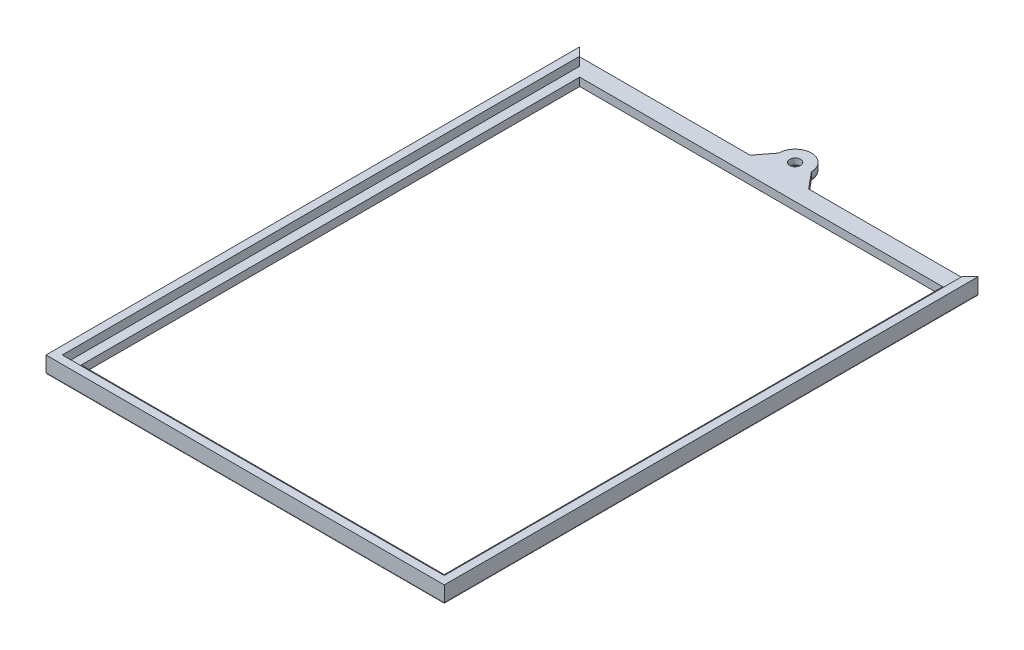
ISO-10303-21;
HEADER;
FILE_DESCRIPTION(('STEP AP214'),'2;1');
FILE_NAME('part.step','',(''),(''),'','','');
FILE_SCHEMA(('AUTOMOTIVE_DESIGN { 1 0 10303 214 1 1 1 1 }'));
ENDSEC;
DATA;
#1=APPLICATION_CONTEXT('core data for automotive mechanical design processes');
#2=APPLICATION_PROTOCOL_DEFINITION('international standard','automotive_design',2000,#1);
#3=PRODUCT_CONTEXT('',#1,'mechanical');
#4=PRODUCT('Part','Part','',(#3));
#5=PRODUCT_RELATED_PRODUCT_CATEGORY('part','',(#4));
#6=PRODUCT_DEFINITION_FORMATION('','',#4);
#7=PRODUCT_DEFINITION_CONTEXT('part definition',#1,'design');
#8=PRODUCT_DEFINITION('design','',#6,#7);
#9=PRODUCT_DEFINITION_SHAPE('','',#8);
#10=(LENGTH_UNIT() NAMED_UNIT(*) SI_UNIT(.MILLI.,.METRE.));
#11=(NAMED_UNIT(*) PLANE_ANGLE_UNIT() SI_UNIT($,.RADIAN.));
#12=(NAMED_UNIT(*) SI_UNIT($,.STERADIAN.) SOLID_ANGLE_UNIT());
#13=UNCERTAINTY_MEASURE_WITH_UNIT(LENGTH_MEASURE(1.E-05),#10,'distance_accuracy_value','');
#14=(GEOMETRIC_REPRESENTATION_CONTEXT(3) GLOBAL_UNCERTAINTY_ASSIGNED_CONTEXT((#13)) GLOBAL_UNIT_ASSIGNED_CONTEXT((#10,
#11,#12)) REPRESENTATION_CONTEXT('',''));
#15=CARTESIAN_POINT('',(0.,0.,0.));
#16=DIRECTION('',(0.,0.,1.));
#17=DIRECTION('',(1.,0.,0.));
#18=AXIS2_PLACEMENT_3D('',#15,#16,#17);
#19=CARTESIAN_POINT('',(0.,1.5,-52.25));
#20=DIRECTION('',(0.,1.,0.));
#21=DIRECTION('',(0.,0.,1.));
#22=AXIS2_PLACEMENT_3D('',#19,#20,#21);
#23=PLANE('',#22);
#24=DIRECTION('',(-1.,0.,0.));
#25=VECTOR('',#24,1.);
#26=CARTESIAN_POINT('',(33.5,1.5,-46.));
#27=LINE('',#26,#25);
#28=CARTESIAN_POINT('',(33.5,1.5,-46.));
#29=VERTEX_POINT('',#28);
#30=CARTESIAN_POINT('',(-33.5,1.5,-46.));
#31=VERTEX_POINT('',#30);
#32=EDGE_CURVE('E246',#29,#31,#27,.T.);
#33=ORIENTED_EDGE('',*,*,#32,.F.);
#34=DIRECTION('',(0.,0.,-1.));
#35=VECTOR('',#34,1.);
#36=CARTESIAN_POINT('',(33.5,1.5,46.));
#37=LINE('',#36,#35);
#38=CARTESIAN_POINT('',(33.5,1.5,46.));
#39=VERTEX_POINT('',#38);
#40=EDGE_CURVE('E244',#39,#29,#37,.T.);
#41=ORIENTED_EDGE('',*,*,#40,.F.);
#42=DIRECTION('',(1.,0.,0.));
#43=VECTOR('',#42,1.);
#44=CARTESIAN_POINT('',(33.5,1.5,46.));
#45=LINE('',#44,#43);
#46=CARTESIAN_POINT('',(-33.5,1.5,46.));
#47=VERTEX_POINT('',#46);
#48=EDGE_CURVE('E252',#47,#39,#45,.T.);
#49=ORIENTED_EDGE('',*,*,#48,.F.);
#50=DIRECTION('',(0.,0.,1.));
#51=VECTOR('',#50,1.);
#52=CARTESIAN_POINT('',(-33.5,1.5,46.));
#53=LINE('',#52,#51);
#54=EDGE_CURVE('E249',#31,#47,#53,.T.);
#55=ORIENTED_EDGE('',*,*,#54,.F.);
#56=EDGE_LOOP('',(#33,#41,#49,#55));
#57=FACE_BOUND('',#56,.T.);
#58=CARTESIAN_POINT('',(0.,1.5,-52.25));
#59=DIRECTION('',(0.,1.,0.));
#60=DIRECTION('',(0.,0.,1.));
#61=AXIS2_PLACEMENT_3D('',#58,#59,#60);
#62=CIRCLE('',#61,1.);
#63=CARTESIAN_POINT('',(0.,1.5,-51.25));
#64=VERTEX_POINT('',#63);
#65=EDGE_CURVE('E191',#64,#64,#62,.T.);
#66=ORIENTED_EDGE('',*,*,#65,.F.);
#67=EDGE_LOOP('',(#66));
#68=FACE_BOUND('',#67,.T.);
#69=DIRECTION('',(0.,0.,-1.));
#70=VECTOR('',#69,1.);
#71=CARTESIAN_POINT('',(35.25,1.5,0.));
#72=LINE('',#71,#70);
#73=CARTESIAN_POINT('',(35.25,1.5,47.75));
#74=VERTEX_POINT('',#73);
#75=CARTESIAN_POINT('',(35.25,1.5,-47.75));
#76=VERTEX_POINT('',#75);
#77=EDGE_CURVE('E222',#74,#76,#72,.T.);
#78=ORIENTED_EDGE('',*,*,#77,.T.);
#79=DIRECTION('',(0.707106781186552,0.,-0.707106781186543));
#80=VECTOR('',#79,1.);
#81=CARTESIAN_POINT('',(-6.25000000000026,1.5,-6.25000000000035));
#82=LINE('',#81,#80);
#83=CARTESIAN_POINT('',(36.75,1.5,-49.25));
#84=VERTEX_POINT('',#83);
#85=EDGE_CURVE('E186',#76,#84,#82,.T.);
#86=ORIENTED_EDGE('',*,*,#85,.T.);
#87=DIRECTION('',(-1.,0.,0.));
#88=VECTOR('',#87,1.);
#89=CARTESIAN_POINT('',(36.75,1.5,-49.25));
#90=LINE('',#89,#88);
#91=CARTESIAN_POINT('',(5.50000000000001,1.5,-49.25));
#92=VERTEX_POINT('',#91);
#93=EDGE_CURVE('E274',#84,#92,#90,.T.);
#94=ORIENTED_EDGE('',*,*,#93,.T.);
#95=DIRECTION('',(-0.640184399664481,0.,-0.768221279597375));
#96=VECTOR('',#95,1.);
#97=CARTESIAN_POINT('',(3.,1.5,-52.25));
#98=LINE('',#97,#96);
#99=CARTESIAN_POINT('',(3.,1.5,-52.25));
#100=VERTEX_POINT('',#99);
#101=EDGE_CURVE('E276',#92,#100,#98,.T.);
#102=ORIENTED_EDGE('',*,*,#101,.T.);
#103=CARTESIAN_POINT('',(0.,1.5,-52.25));
#104=DIRECTION('',(0.,1.,0.));
#105=DIRECTION('',(0.,0.,1.));
#106=AXIS2_PLACEMENT_3D('',#103,#104,#105);
#107=CIRCLE('',#106,3.);
#108=CARTESIAN_POINT('',(-3.,1.5,-52.25));
#109=VERTEX_POINT('',#108);
#110=EDGE_CURVE('E278',#100,#109,#107,.T.);
#111=ORIENTED_EDGE('',*,*,#110,.T.);
#112=DIRECTION('',(-0.608519921560941,0.,0.793538597084897));
#113=VECTOR('',#112,1.);
#114=CARTESIAN_POINT('',(-5.30053052414729,1.5,-49.25));
#115=LINE('',#114,#113);
#116=CARTESIAN_POINT('',(-5.30053052414729,1.5,-49.25));
#117=VERTEX_POINT('',#116);
#118=EDGE_CURVE('E280',#109,#117,#115,.T.);
#119=ORIENTED_EDGE('',*,*,#118,.T.);
#120=DIRECTION('',(-1.,0.,0.));
#121=VECTOR('',#120,1.);
#122=CARTESIAN_POINT('',(-5.30053052414729,1.5,-49.25));
#123=LINE('',#122,#121);
#124=CARTESIAN_POINT('',(-36.75,1.5,-49.25));
#125=VERTEX_POINT('',#124);
#126=EDGE_CURVE('E282',#117,#125,#123,.T.);
#127=ORIENTED_EDGE('',*,*,#126,.T.);
#128=DIRECTION('',(-0.707106781186548,0.,-0.707106781186548));
#129=VECTOR('',#128,1.);
#130=CARTESIAN_POINT('',(6.25000000000001,1.5,-6.25000000000001));
#131=LINE('',#130,#129);
#132=CARTESIAN_POINT('',(-35.25,1.5,-47.75));
#133=VERTEX_POINT('',#132);
#134=EDGE_CURVE('E202',#133,#125,#131,.T.);
#135=ORIENTED_EDGE('',*,*,#134,.F.);
#136=DIRECTION('',(0.,0.,-1.));
#137=VECTOR('',#136,1.);
#138=CARTESIAN_POINT('',(-35.25,1.5,0.));
#139=LINE('',#138,#137);
#140=CARTESIAN_POINT('',(-35.25,1.5,47.75));
#141=VERTEX_POINT('',#140);
#142=EDGE_CURVE('E227',#141,#133,#139,.T.);
#143=ORIENTED_EDGE('',*,*,#142,.F.);
#144=DIRECTION('',(-1.,0.,0.));
#145=VECTOR('',#144,1.);
#146=CARTESIAN_POINT('',(0.,1.5,47.75));
#147=LINE('',#146,#145);
#148=EDGE_CURVE('E225',#74,#141,#147,.T.);
#149=ORIENTED_EDGE('',*,*,#148,.F.);
#150=EDGE_LOOP('',(#78,#86,#94,#102,#111,#119,#127,#135,#143,#149));
#151=FACE_BOUND('',#150,.T.);
#152=ADVANCED_FACE('F37',(#57,#68,#151),#23,.T.);
#153=CARTESIAN_POINT('',(0.,0.,-52.25));
#154=DIRECTION('',(0.,1.,0.));
#155=DIRECTION('',(0.,0.,1.));
#156=AXIS2_PLACEMENT_3D('',#153,#154,#155);
#157=PLANE('',#156);
#158=CARTESIAN_POINT('',(0.,0.,-52.25));
#159=DIRECTION('',(0.,1.,0.));
#160=DIRECTION('',(0.,0.,1.));
#161=AXIS2_PLACEMENT_3D('',#158,#159,#160);
#162=CIRCLE('',#161,1.5);
#163=CARTESIAN_POINT('',(0.,0.,-50.75));
#164=VERTEX_POINT('',#163);
#165=EDGE_CURVE('E45',#164,#164,#162,.T.);
#166=ORIENTED_EDGE('',*,*,#165,.T.);
#167=EDGE_LOOP('',(#166));
#168=FACE_BOUND('',#167,.T.);
#169=DIRECTION('',(0.,0.,1.));
#170=VECTOR('',#169,1.);
#171=CARTESIAN_POINT('',(-36.45,0.,-52.25));
#172=LINE('',#171,#170);
#173=CARTESIAN_POINT('',(-36.45,0.,48.95));
#174=VERTEX_POINT('',#173);
#175=CARTESIAN_POINT('',(-36.45,0.,-48.95));
#176=VERTEX_POINT('',#175);
#177=EDGE_CURVE('E309',#174,#176,#172,.F.);
#178=ORIENTED_EDGE('',*,*,#177,.T.);
#179=DIRECTION('',(-1.,0.,0.));
#180=VECTOR('',#179,1.);
#181=CARTESIAN_POINT('',(0.,0.,-48.95));
#182=LINE('',#181,#180);
#183=CARTESIAN_POINT('',(-5.15253013202628,0.,-48.95));
#184=VERTEX_POINT('',#183);
#185=EDGE_CURVE('E323',#176,#184,#182,.F.);
#186=ORIENTED_EDGE('',*,*,#185,.T.);
#187=DIRECTION('',(-0.608519921560941,0.,0.793538597084897));
#188=VECTOR('',#187,1.);
#189=CARTESIAN_POINT('',(-1.65104893606493,0.,-53.5160961580928));
#190=LINE('',#189,#188);
#191=CARTESIAN_POINT('',(-2.6981697345166,0.,-52.1506013896544));
#192=VERTEX_POINT('',#191);
#193=EDGE_CURVE('E321',#184,#192,#190,.F.);
#194=ORIENTED_EDGE('',*,*,#193,.T.);
#195=CARTESIAN_POINT('',(0.,0.,-52.25));
#196=DIRECTION('',(0.,1.,0.));
#197=DIRECTION('',(0.,0.,1.));
#198=AXIS2_PLACEMENT_3D('',#195,#196,#197);
#199=CIRCLE('',#198,2.7);
#200=CARTESIAN_POINT('',(2.69791405992967,0.,-52.14388814753));
#201=VERTEX_POINT('',#200);
#202=EDGE_CURVE('E319',#192,#201,#199,.F.);
#203=ORIENTED_EDGE('',*,*,#202,.T.);
#204=DIRECTION('',(-0.640184399664481,0.,-0.768221279597375));
#205=VECTOR('',#204,1.);
#206=CARTESIAN_POINT('',(1.54002541939947,0.,-53.5333545161662));
#207=LINE('',#206,#205);
#208=CARTESIAN_POINT('',(5.35948751620468,0.,-48.95));
#209=VERTEX_POINT('',#208);
#210=EDGE_CURVE('E317',#201,#209,#207,.F.);
#211=ORIENTED_EDGE('',*,*,#210,.T.);
#212=DIRECTION('',(-1.,0.,0.));
#213=VECTOR('',#212,1.);
#214=CARTESIAN_POINT('',(0.,0.,-48.95));
#215=LINE('',#214,#213);
#216=CARTESIAN_POINT('',(36.45,0.,-48.95));
#217=VERTEX_POINT('',#216);
#218=EDGE_CURVE('E315',#209,#217,#215,.F.);
#219=ORIENTED_EDGE('',*,*,#218,.T.);
#220=DIRECTION('',(0.,0.,-1.));
#221=VECTOR('',#220,1.);
#222=CARTESIAN_POINT('',(36.45,0.,-52.25));
#223=LINE('',#222,#221);
#224=CARTESIAN_POINT('',(36.45,0.,48.95));
#225=VERTEX_POINT('',#224);
#226=EDGE_CURVE('E313',#217,#225,#223,.F.);
#227=ORIENTED_EDGE('',*,*,#226,.T.);
#228=DIRECTION('',(1.,0.,0.));
#229=VECTOR('',#228,1.);
#230=CARTESIAN_POINT('',(0.,0.,48.95));
#231=LINE('',#230,#229);
#232=EDGE_CURVE('E311',#225,#174,#231,.F.);
#233=ORIENTED_EDGE('',*,*,#232,.T.);
#234=EDGE_LOOP('',(#178,#186,#194,#203,#211,#219,#227,#233));
#235=FACE_BOUND('',#234,.T.);
#236=DIRECTION('',(0.,0.,-1.));
#237=VECTOR('',#236,1.);
#238=CARTESIAN_POINT('',(33.5,0.,46.));
#239=LINE('',#238,#237);
#240=CARTESIAN_POINT('',(33.5,0.,46.));
#241=VERTEX_POINT('',#240);
#242=CARTESIAN_POINT('',(33.5,0.,-46.));
#243=VERTEX_POINT('',#242);
#244=EDGE_CURVE('E243',#241,#243,#239,.T.);
#245=ORIENTED_EDGE('',*,*,#244,.T.);
#246=DIRECTION('',(-1.,0.,0.));
#247=VECTOR('',#246,1.);
#248=CARTESIAN_POINT('',(33.5,0.,-46.));
#249=LINE('',#248,#247);
#250=CARTESIAN_POINT('',(-33.5,0.,-46.));
#251=VERTEX_POINT('',#250);
#252=EDGE_CURVE('E257',#243,#251,#249,.T.);
#253=ORIENTED_EDGE('',*,*,#252,.T.);
#254=DIRECTION('',(0.,0.,1.));
#255=VECTOR('',#254,1.);
#256=CARTESIAN_POINT('',(-33.5,0.,46.));
#257=LINE('',#256,#255);
#258=CARTESIAN_POINT('',(-33.5,0.,46.));
#259=VERTEX_POINT('',#258);
#260=EDGE_CURVE('E260',#251,#259,#257,.T.);
#261=ORIENTED_EDGE('',*,*,#260,.T.);
#262=DIRECTION('',(1.,0.,0.));
#263=VECTOR('',#262,1.);
#264=CARTESIAN_POINT('',(33.5,0.,46.));
#265=LINE('',#264,#263);
#266=EDGE_CURVE('E247',#259,#241,#265,.T.);
#267=ORIENTED_EDGE('',*,*,#266,.T.);
#268=EDGE_LOOP('',(#245,#253,#261,#267));
#269=FACE_BOUND('',#268,.T.);
#270=ADVANCED_FACE('F388',(#168,#235,#269),#157,.F.);
#271=CARTESIAN_POINT('',(36.75,1.5,49.25));
#272=DIRECTION('',(-1.,0.,0.));
#273=DIRECTION('',(0.,0.,1.));
#274=AXIS2_PLACEMENT_3D('',#271,#272,#273);
#275=PLANE('',#274);
#276=DIRECTION('',(0.,-1.,0.));
#277=VECTOR('',#276,1.);
#278=CARTESIAN_POINT('',(36.75,1.5,49.25));
#279=LINE('',#278,#277);
#280=CARTESIAN_POINT('',(36.75,3.1,49.25));
#281=VERTEX_POINT('',#280);
#282=CARTESIAN_POINT('',(36.75,0.3,49.25));
#283=VERTEX_POINT('',#282);
#284=EDGE_CURVE('E285',#281,#283,#279,.T.);
#285=ORIENTED_EDGE('',*,*,#284,.T.);
#286=DIRECTION('',(0.,0.,-1.));
#287=VECTOR('',#286,1.);
#288=CARTESIAN_POINT('',(36.75,0.3,49.25));
#289=LINE('',#288,#287);
#290=CARTESIAN_POINT('',(36.75,0.3,-49.25));
#291=VERTEX_POINT('',#290);
#292=EDGE_CURVE('E334',#283,#291,#289,.T.);
#293=ORIENTED_EDGE('',*,*,#292,.T.);
#294=DIRECTION('',(0.,-1.,0.));
#295=VECTOR('',#294,1.);
#296=CARTESIAN_POINT('',(36.75,1.5,-49.25));
#297=LINE('',#296,#295);
#298=EDGE_CURVE('E303',#84,#291,#297,.T.);
#299=ORIENTED_EDGE('',*,*,#298,.F.);
#300=DIRECTION('',(0.,-1.,0.));
#301=VECTOR('',#300,1.);
#302=CARTESIAN_POINT('',(36.75,3.1,-49.25));
#303=LINE('',#302,#301);
#304=CARTESIAN_POINT('',(36.75,3.1,-49.25));
#305=VERTEX_POINT('',#304);
#306=EDGE_CURVE('E220',#305,#84,#303,.T.);
#307=ORIENTED_EDGE('',*,*,#306,.F.);
#308=DIRECTION('',(0.,0.,-1.));
#309=VECTOR('',#308,1.);
#310=CARTESIAN_POINT('',(36.75,3.1,0.));
#311=LINE('',#310,#309);
#312=EDGE_CURVE('E200',#281,#305,#311,.T.);
#313=ORIENTED_EDGE('',*,*,#312,.F.);
#314=EDGE_LOOP('',(#285,#293,#299,#307,#313));
#315=FACE_BOUND('',#314,.T.);
#316=ADVANCED_FACE('F406',(#315),#275,.F.);
#317=CARTESIAN_POINT('',(36.75,1.5,-49.25));
#318=DIRECTION('',(0.,0.,1.));
#319=DIRECTION('',(1.,0.,0.));
#320=AXIS2_PLACEMENT_3D('',#317,#318,#319);
#321=PLANE('',#320);
#322=ORIENTED_EDGE('',*,*,#298,.T.);
#323=DIRECTION('',(-1.,0.,0.));
#324=VECTOR('',#323,1.);
#325=CARTESIAN_POINT('',(36.75,0.3,-49.25));
#326=LINE('',#325,#324);
#327=CARTESIAN_POINT('',(5.50000000000001,0.3,-49.25));
#328=VERTEX_POINT('',#327);
#329=EDGE_CURVE('E332',#291,#328,#326,.T.);
#330=ORIENTED_EDGE('',*,*,#329,.T.);
#331=DIRECTION('',(0.,-1.,0.));
#332=VECTOR('',#331,1.);
#333=CARTESIAN_POINT('',(5.50000000000001,1.5,-49.25));
#334=LINE('',#333,#332);
#335=EDGE_CURVE('E300',#92,#328,#334,.T.);
#336=ORIENTED_EDGE('',*,*,#335,.F.);
#337=ORIENTED_EDGE('',*,*,#93,.F.);
#338=EDGE_LOOP('',(#322,#330,#336,#337));
#339=FACE_BOUND('',#338,.T.);
#340=ADVANCED_FACE('F435',(#339),#321,.F.);
#341=CARTESIAN_POINT('',(3.,1.5,-52.25));
#342=DIRECTION('',(-0.768221279597375,0.,0.640184399664481));
#343=DIRECTION('',(0.640184399664481,0.,0.768221279597375));
#344=AXIS2_PLACEMENT_3D('',#341,#342,#343);
#345=PLANE('',#344);
#346=ORIENTED_EDGE('',*,*,#335,.T.);
#347=DIRECTION('',(-0.640184399664481,0.,-0.768221279597375));
#348=VECTOR('',#347,1.);
#349=CARTESIAN_POINT('',(3.,0.3,-52.25));
#350=LINE('',#349,#348);
#351=CARTESIAN_POINT('',(3.,0.3,-52.25));
#352=VERTEX_POINT('',#351);
#353=EDGE_CURVE('E330',#328,#352,#350,.T.);
#354=ORIENTED_EDGE('',*,*,#353,.T.);
#355=DIRECTION('',(0.,-1.,0.));
#356=VECTOR('',#355,1.);
#357=CARTESIAN_POINT('',(3.,1.5,-52.25));
#358=LINE('',#357,#356);
#359=EDGE_CURVE('E297',#100,#352,#358,.T.);
#360=ORIENTED_EDGE('',*,*,#359,.F.);
#361=ORIENTED_EDGE('',*,*,#101,.F.);
#362=EDGE_LOOP('',(#346,#354,#360,#361));
#363=FACE_BOUND('',#362,.T.);
#364=ADVANCED_FACE('F431',(#363),#345,.F.);
#365=CARTESIAN_POINT('',(0.,1.5,-52.25));
#366=DIRECTION('',(0.,-1.,0.));
#367=DIRECTION('',(0.,0.,-1.));
#368=AXIS2_PLACEMENT_3D('',#365,#366,#367);
#369=CYLINDRICAL_SURFACE('',#368,3.);
#370=ORIENTED_EDGE('',*,*,#359,.T.);
#371=CARTESIAN_POINT('',(0.,0.3,-52.25));
#372=DIRECTION('',(0.,1.,0.));
#373=DIRECTION('',(0.,0.,1.));
#374=AXIS2_PLACEMENT_3D('',#371,#372,#373);
#375=CIRCLE('',#374,3.);
#376=CARTESIAN_POINT('',(-3.,0.3,-52.25));
#377=VERTEX_POINT('',#376);
#378=EDGE_CURVE('E328',#352,#377,#375,.T.);
#379=ORIENTED_EDGE('',*,*,#378,.T.);
#380=DIRECTION('',(0.,-1.,0.));
#381=VECTOR('',#380,1.);
#382=CARTESIAN_POINT('',(-3.,1.5,-52.25));
#383=LINE('',#382,#381);
#384=EDGE_CURVE('E294',#109,#377,#383,.T.);
#385=ORIENTED_EDGE('',*,*,#384,.F.);
#386=ORIENTED_EDGE('',*,*,#110,.F.);
#387=EDGE_LOOP('',(#370,#379,#385,#386));
#388=FACE_BOUND('',#387,.T.);
#389=ADVANCED_FACE('F427',(#388),#369,.T.);
#390=CARTESIAN_POINT('',(-5.30053052414729,1.5,-49.25));
#391=DIRECTION('',(0.793538597084897,0.,0.608519921560941));
#392=DIRECTION('',(0.608519921560941,0.,-0.793538597084897));
#393=AXIS2_PLACEMENT_3D('',#390,#391,#392);
#394=PLANE('',#393);
#395=ORIENTED_EDGE('',*,*,#384,.T.);
#396=DIRECTION('',(-0.608519921560941,0.,0.793538597084897));
#397=VECTOR('',#396,1.);
#398=CARTESIAN_POINT('',(-5.30053052414729,0.3,-49.25));
#399=LINE('',#398,#397);
#400=CARTESIAN_POINT('',(-5.30053052414729,0.3,-49.25));
#401=VERTEX_POINT('',#400);
#402=EDGE_CURVE('E326',#377,#401,#399,.T.);
#403=ORIENTED_EDGE('',*,*,#402,.T.);
#404=DIRECTION('',(0.,-1.,0.));
#405=VECTOR('',#404,1.);
#406=CARTESIAN_POINT('',(-5.30053052414729,1.5,-49.25));
#407=LINE('',#406,#405);
#408=EDGE_CURVE('E291',#117,#401,#407,.T.);
#409=ORIENTED_EDGE('',*,*,#408,.F.);
#410=ORIENTED_EDGE('',*,*,#118,.F.);
#411=EDGE_LOOP('',(#395,#403,#409,#410));
#412=FACE_BOUND('',#411,.T.);
#413=ADVANCED_FACE('F423',(#412),#394,.F.);
#414=CARTESIAN_POINT('',(-5.30053052414729,1.5,-49.25));
#415=DIRECTION('',(0.,0.,1.));
#416=DIRECTION('',(1.,0.,0.));
#417=AXIS2_PLACEMENT_3D('',#414,#415,#416);
#418=PLANE('',#417);
#419=ORIENTED_EDGE('',*,*,#408,.T.);
#420=DIRECTION('',(-1.,0.,0.));
#421=VECTOR('',#420,1.);
#422=CARTESIAN_POINT('',(-5.30053052414729,0.3,-49.25));
#423=LINE('',#422,#421);
#424=CARTESIAN_POINT('',(-36.75,0.3,-49.25));
#425=VERTEX_POINT('',#424);
#426=EDGE_CURVE('E306',#401,#425,#423,.T.);
#427=ORIENTED_EDGE('',*,*,#426,.T.);
#428=DIRECTION('',(0.,-1.,0.));
#429=VECTOR('',#428,1.);
#430=CARTESIAN_POINT('',(-36.75,1.5,-49.25));
#431=LINE('',#430,#429);
#432=EDGE_CURVE('E289',#125,#425,#431,.T.);
#433=ORIENTED_EDGE('',*,*,#432,.F.);
#434=ORIENTED_EDGE('',*,*,#126,.F.);
#435=EDGE_LOOP('',(#419,#427,#433,#434));
#436=FACE_BOUND('',#435,.T.);
#437=ADVANCED_FACE('F420',(#436),#418,.F.);
#438=CARTESIAN_POINT('',(-36.75,1.5,49.25));
#439=DIRECTION('',(1.,0.,0.));
#440=DIRECTION('',(0.,0.,-1.));
#441=AXIS2_PLACEMENT_3D('',#438,#439,#440);
#442=PLANE('',#441);
#443=ORIENTED_EDGE('',*,*,#432,.T.);
#444=DIRECTION('',(0.,0.,1.));
#445=VECTOR('',#444,1.);
#446=CARTESIAN_POINT('',(-36.75,0.3,49.25));
#447=LINE('',#446,#445);
#448=CARTESIAN_POINT('',(-36.75,0.3,49.25));
#449=VERTEX_POINT('',#448);
#450=EDGE_CURVE('E52',#425,#449,#447,.T.);
#451=ORIENTED_EDGE('',*,*,#450,.T.);
#452=DIRECTION('',(0.,-1.,0.));
#453=VECTOR('',#452,1.);
#454=CARTESIAN_POINT('',(-36.75,1.5,49.25));
#455=LINE('',#454,#453);
#456=CARTESIAN_POINT('',(-36.75,3.1,49.25));
#457=VERTEX_POINT('',#456);
#458=EDGE_CURVE('E287',#457,#449,#455,.T.);
#459=ORIENTED_EDGE('',*,*,#458,.F.);
#460=DIRECTION('',(0.,0.,1.));
#461=VECTOR('',#460,1.);
#462=CARTESIAN_POINT('',(-36.75,3.1,0.));
#463=LINE('',#462,#461);
#464=CARTESIAN_POINT('',(-36.75,3.1,-49.25));
#465=VERTEX_POINT('',#464);
#466=EDGE_CURVE('E214',#465,#457,#463,.T.);
#467=ORIENTED_EDGE('',*,*,#466,.F.);
#468=DIRECTION('',(0.,-1.,0.));
#469=VECTOR('',#468,1.);
#470=CARTESIAN_POINT('',(-36.75,3.1,-49.25));
#471=LINE('',#470,#469);
#472=EDGE_CURVE('E231',#465,#125,#471,.T.);
#473=ORIENTED_EDGE('',*,*,#472,.T.);
#474=EDGE_LOOP('',(#443,#451,#459,#467,#473));
#475=FACE_BOUND('',#474,.T.);
#476=ADVANCED_FACE('F417',(#475),#442,.F.);
#477=CARTESIAN_POINT('',(36.75,1.5,49.25));
#478=DIRECTION('',(0.,0.,-1.));
#479=DIRECTION('',(-1.,0.,0.));
#480=AXIS2_PLACEMENT_3D('',#477,#478,#479);
#481=PLANE('',#480);
#482=ORIENTED_EDGE('',*,*,#458,.T.);
#483=DIRECTION('',(1.,0.,0.));
#484=VECTOR('',#483,1.);
#485=CARTESIAN_POINT('',(36.75,0.3,49.25));
#486=LINE('',#485,#484);
#487=EDGE_CURVE('E59',#449,#283,#486,.T.);
#488=ORIENTED_EDGE('',*,*,#487,.T.);
#489=ORIENTED_EDGE('',*,*,#284,.F.);
#490=DIRECTION('',(1.,0.,0.));
#491=VECTOR('',#490,1.);
#492=CARTESIAN_POINT('',(0.,3.1,49.25));
#493=LINE('',#492,#491);
#494=EDGE_CURVE('E217',#457,#281,#493,.T.);
#495=ORIENTED_EDGE('',*,*,#494,.F.);
#496=EDGE_LOOP('',(#482,#488,#489,#495));
#497=FACE_BOUND('',#496,.T.);
#498=ADVANCED_FACE('F414',(#497),#481,.F.);
#499=CARTESIAN_POINT('',(33.5,1.5,46.));
#500=DIRECTION('',(-1.,0.,0.));
#501=DIRECTION('',(0.,0.,1.));
#502=AXIS2_PLACEMENT_3D('',#499,#500,#501);
#503=PLANE('',#502);
#504=ORIENTED_EDGE('',*,*,#244,.F.);
#505=DIRECTION('',(0.,-1.,0.));
#506=VECTOR('',#505,1.);
#507=CARTESIAN_POINT('',(33.5,1.5,46.));
#508=LINE('',#507,#506);
#509=EDGE_CURVE('E254',#39,#241,#508,.T.);
#510=ORIENTED_EDGE('',*,*,#509,.F.);
#511=ORIENTED_EDGE('',*,*,#40,.T.);
#512=DIRECTION('',(0.,-1.,0.));
#513=VECTOR('',#512,1.);
#514=CARTESIAN_POINT('',(33.5,1.5,-46.));
#515=LINE('',#514,#513);
#516=EDGE_CURVE('E271',#29,#243,#515,.T.);
#517=ORIENTED_EDGE('',*,*,#516,.T.);
#518=EDGE_LOOP('',(#504,#510,#511,#517));
#519=FACE_BOUND('',#518,.T.);
#520=ADVANCED_FACE('F411',(#519),#503,.T.);
#521=CARTESIAN_POINT('',(33.5,1.5,-46.));
#522=DIRECTION('',(0.,0.,1.));
#523=DIRECTION('',(1.,0.,0.));
#524=AXIS2_PLACEMENT_3D('',#521,#522,#523);
#525=PLANE('',#524);
#526=ORIENTED_EDGE('',*,*,#252,.F.);
#527=ORIENTED_EDGE('',*,*,#516,.F.);
#528=ORIENTED_EDGE('',*,*,#32,.T.);
#529=DIRECTION('',(0.,-1.,0.));
#530=VECTOR('',#529,1.);
#531=CARTESIAN_POINT('',(-33.5,1.5,-46.));
#532=LINE('',#531,#530);
#533=EDGE_CURVE('E269',#31,#251,#532,.T.);
#534=ORIENTED_EDGE('',*,*,#533,.T.);
#535=EDGE_LOOP('',(#526,#527,#528,#534));
#536=FACE_BOUND('',#535,.T.);
#537=ADVANCED_FACE('F578',(#536),#525,.T.);
#538=CARTESIAN_POINT('',(-33.5,1.5,46.));
#539=DIRECTION('',(1.,0.,0.));
#540=DIRECTION('',(0.,0.,-1.));
#541=AXIS2_PLACEMENT_3D('',#538,#539,#540);
#542=PLANE('',#541);
#543=ORIENTED_EDGE('',*,*,#260,.F.);
#544=ORIENTED_EDGE('',*,*,#533,.F.);
#545=ORIENTED_EDGE('',*,*,#54,.T.);
#546=DIRECTION('',(0.,-1.,0.));
#547=VECTOR('',#546,1.);
#548=CARTESIAN_POINT('',(-33.5,1.5,46.));
#549=LINE('',#548,#547);
#550=EDGE_CURVE('E267',#47,#259,#549,.T.);
#551=ORIENTED_EDGE('',*,*,#550,.T.);
#552=EDGE_LOOP('',(#543,#544,#545,#551));
#553=FACE_BOUND('',#552,.T.);
#554=ADVANCED_FACE('F570',(#553),#542,.T.);
#555=CARTESIAN_POINT('',(33.5,1.5,46.));
#556=DIRECTION('',(0.,0.,-1.));
#557=DIRECTION('',(-1.,0.,0.));
#558=AXIS2_PLACEMENT_3D('',#555,#556,#557);
#559=PLANE('',#558);
#560=ORIENTED_EDGE('',*,*,#266,.F.);
#561=ORIENTED_EDGE('',*,*,#550,.F.);
#562=ORIENTED_EDGE('',*,*,#48,.T.);
#563=ORIENTED_EDGE('',*,*,#509,.T.);
#564=EDGE_LOOP('',(#560,#561,#562,#563));
#565=FACE_BOUND('',#564,.T.);
#566=ADVANCED_FACE('F561',(#565),#559,.T.);
#567=CARTESIAN_POINT('',(0.,1.5,-52.25));
#568=DIRECTION('',(0.,-1.,0.));
#569=DIRECTION('',(0.,0.,-1.));
#570=AXIS2_PLACEMENT_3D('',#567,#568,#569);
#571=CYLINDRICAL_SURFACE('',#570,1.);
#572=CARTESIAN_POINT('',(0.,0.5,-52.25));
#573=DIRECTION('',(0.,1.,0.));
#574=DIRECTION('',(0.,0.,1.));
#575=AXIS2_PLACEMENT_3D('',#572,#573,#574);
#576=CIRCLE('',#575,1.);
#577=CARTESIAN_POINT('',(0.,0.5,-51.25));
#578=VERTEX_POINT('',#577);
#579=EDGE_CURVE('E11',#578,#578,#576,.F.);
#580=ORIENTED_EDGE('',*,*,#579,.T.);
#581=EDGE_LOOP('',(#580));
#582=FACE_BOUND('',#581,.T.);
#583=ORIENTED_EDGE('',*,*,#65,.T.);
#584=EDGE_LOOP('',(#583));
#585=FACE_BOUND('',#584,.T.);
#586=ADVANCED_FACE('F554',(#582,#585),#571,.F.);
#587=CARTESIAN_POINT('',(-6.25000000000026,3.1,-6.25000000000035));
#588=DIRECTION('',(-0.707106781186543,0.,-0.707106781186552));
#589=DIRECTION('',(-0.707106781186552,0.,0.707106781186543));
#590=AXIS2_PLACEMENT_3D('',#587,#588,#589);
#591=PLANE('',#590);
#592=ORIENTED_EDGE('',*,*,#85,.F.);
#593=DIRECTION('',(0.,-1.,0.));
#594=VECTOR('',#593,1.);
#595=CARTESIAN_POINT('',(35.25,3.1,-47.75));
#596=LINE('',#595,#594);
#597=CARTESIAN_POINT('',(35.25,3.1,-47.75));
#598=VERTEX_POINT('',#597);
#599=EDGE_CURVE('E181',#598,#76,#596,.T.);
#600=ORIENTED_EDGE('',*,*,#599,.F.);
#601=DIRECTION('',(0.707106781186552,0.,-0.707106781186543));
#602=VECTOR('',#601,1.);
#603=CARTESIAN_POINT('',(-6.25000000000026,3.1,-6.25000000000035));
#604=LINE('',#603,#602);
#605=EDGE_CURVE('E184',#598,#305,#604,.T.);
#606=ORIENTED_EDGE('',*,*,#605,.T.);
#607=ORIENTED_EDGE('',*,*,#306,.T.);
#608=EDGE_LOOP('',(#592,#600,#606,#607));
#609=FACE_BOUND('',#608,.T.);
#610=ADVANCED_FACE('F183',(#609),#591,.T.);
#611=CARTESIAN_POINT('',(35.25,3.1,0.));
#612=DIRECTION('',(-1.,0.,0.));
#613=DIRECTION('',(0.,0.,1.));
#614=AXIS2_PLACEMENT_3D('',#611,#612,#613);
#615=PLANE('',#614);
#616=ORIENTED_EDGE('',*,*,#77,.F.);
#617=DIRECTION('',(0.,-1.,0.));
#618=VECTOR('',#617,1.);
#619=CARTESIAN_POINT('',(35.25,3.1,47.75));
#620=LINE('',#619,#618);
#621=CARTESIAN_POINT('',(35.25,3.1,47.75));
#622=VERTEX_POINT('',#621);
#623=EDGE_CURVE('E192',#622,#74,#620,.T.);
#624=ORIENTED_EDGE('',*,*,#623,.F.);
#625=DIRECTION('',(0.,0.,-1.));
#626=VECTOR('',#625,1.);
#627=CARTESIAN_POINT('',(35.25,3.1,0.));
#628=LINE('',#627,#626);
#629=EDGE_CURVE('E197',#622,#598,#628,.T.);
#630=ORIENTED_EDGE('',*,*,#629,.T.);
#631=ORIENTED_EDGE('',*,*,#599,.T.);
#632=EDGE_LOOP('',(#616,#624,#630,#631));
#633=FACE_BOUND('',#632,.T.);
#634=ADVANCED_FACE('F204',(#633),#615,.T.);
#635=CARTESIAN_POINT('',(0.,3.1,47.75));
#636=DIRECTION('',(0.,0.,1.));
#637=DIRECTION('',(1.,0.,0.));
#638=AXIS2_PLACEMENT_3D('',#635,#636,#637);
#639=PLANE('',#638);
#640=ORIENTED_EDGE('',*,*,#148,.T.);
#641=DIRECTION('',(0.,-1.,0.));
#642=VECTOR('',#641,1.);
#643=CARTESIAN_POINT('',(-35.25,3.1,47.75));
#644=LINE('',#643,#642);
#645=CARTESIAN_POINT('',(-35.25,3.1,47.75));
#646=VERTEX_POINT('',#645);
#647=EDGE_CURVE('E237',#646,#141,#644,.T.);
#648=ORIENTED_EDGE('',*,*,#647,.F.);
#649=DIRECTION('',(-1.,0.,0.));
#650=VECTOR('',#649,1.);
#651=CARTESIAN_POINT('',(0.,3.1,47.75));
#652=LINE('',#651,#650);
#653=EDGE_CURVE('E206',#622,#646,#652,.T.);
#654=ORIENTED_EDGE('',*,*,#653,.F.);
#655=ORIENTED_EDGE('',*,*,#623,.T.);
#656=EDGE_LOOP('',(#640,#648,#654,#655));
#657=FACE_BOUND('',#656,.T.);
#658=ADVANCED_FACE('F479',(#657),#639,.F.);
#659=CARTESIAN_POINT('',(-35.25,3.1,0.));
#660=DIRECTION('',(-1.,0.,0.));
#661=DIRECTION('',(0.,0.,1.));
#662=AXIS2_PLACEMENT_3D('',#659,#660,#661);
#663=PLANE('',#662);
#664=ORIENTED_EDGE('',*,*,#142,.T.);
#665=DIRECTION('',(0.,-1.,0.));
#666=VECTOR('',#665,1.);
#667=CARTESIAN_POINT('',(-35.25,3.1,-47.75));
#668=LINE('',#667,#666);
#669=CARTESIAN_POINT('',(-35.25,3.1,-47.75));
#670=VERTEX_POINT('',#669);
#671=EDGE_CURVE('E234',#670,#133,#668,.T.);
#672=ORIENTED_EDGE('',*,*,#671,.F.);
#673=DIRECTION('',(0.,0.,-1.));
#674=VECTOR('',#673,1.);
#675=CARTESIAN_POINT('',(-35.25,3.1,0.));
#676=LINE('',#675,#674);
#677=EDGE_CURVE('E208',#646,#670,#676,.T.);
#678=ORIENTED_EDGE('',*,*,#677,.F.);
#679=ORIENTED_EDGE('',*,*,#647,.T.);
#680=EDGE_LOOP('',(#664,#672,#678,#679));
#681=FACE_BOUND('',#680,.T.);
#682=ADVANCED_FACE('F482',(#681),#663,.F.);
#683=CARTESIAN_POINT('',(6.25000000000001,3.1,-6.25000000000001));
#684=DIRECTION('',(-0.707106781186548,0.,0.707106781186548));
#685=DIRECTION('',(0.707106781186548,0.,0.707106781186548));
#686=AXIS2_PLACEMENT_3D('',#683,#684,#685);
#687=PLANE('',#686);
#688=ORIENTED_EDGE('',*,*,#134,.T.);
#689=ORIENTED_EDGE('',*,*,#472,.F.);
#690=DIRECTION('',(-0.707106781186548,0.,-0.707106781186548));
#691=VECTOR('',#690,1.);
#692=CARTESIAN_POINT('',(6.25000000000001,3.1,-6.25000000000001));
#693=LINE('',#692,#691);
#694=EDGE_CURVE('E212',#670,#465,#693,.T.);
#695=ORIENTED_EDGE('',*,*,#694,.F.);
#696=ORIENTED_EDGE('',*,*,#671,.T.);
#697=EDGE_LOOP('',(#688,#689,#695,#696));
#698=FACE_BOUND('',#697,.T.);
#699=ADVANCED_FACE('F489',(#698),#687,.F.);
#700=CARTESIAN_POINT('',(0.,3.1,0.));
#701=DIRECTION('',(0.,1.,0.));
#702=DIRECTION('',(0.,0.,1.));
#703=AXIS2_PLACEMENT_3D('',#700,#701,#702);
#704=PLANE('',#703);
#705=ORIENTED_EDGE('',*,*,#605,.F.);
#706=ORIENTED_EDGE('',*,*,#629,.F.);
#707=ORIENTED_EDGE('',*,*,#653,.T.);
#708=ORIENTED_EDGE('',*,*,#677,.T.);
#709=ORIENTED_EDGE('',*,*,#694,.T.);
#710=ORIENTED_EDGE('',*,*,#466,.T.);
#711=ORIENTED_EDGE('',*,*,#494,.T.);
#712=ORIENTED_EDGE('',*,*,#312,.T.);
#713=EDGE_LOOP('',(#705,#706,#707,#708,#709,#710,#711,#712));
#714=FACE_BOUND('',#713,.T.);
#715=ADVANCED_FACE('F196',(#714),#704,.T.);
#716=CARTESIAN_POINT('',(36.75,0.3,-48.95));
#717=DIRECTION('',(-1.,0.,0.));
#718=DIRECTION('',(0.,0.,1.));
#719=AXIS2_PLACEMENT_3D('',#716,#717,#718);
#720=CYLINDRICAL_SURFACE('',#719,0.3);
#721=CARTESIAN_POINT('',(36.45,0.3,-48.95));
#722=DIRECTION('',(-0.707106781186548,0.,-0.707106781186547));
#723=DIRECTION('',(0.707106781186547,0.,-0.707106781186548));
#724=AXIS2_PLACEMENT_3D('',#721,#722,#723);
#725=ELLIPSE('',#724,0.424264068711929,0.3);
#726=EDGE_CURVE('E381',#217,#291,#725,.F.);
#727=ORIENTED_EDGE('',*,*,#726,.F.);
#728=ORIENTED_EDGE('',*,*,#218,.F.);
#729=CARTESIAN_POINT('',(5.35948751620467,0.3,-48.95));
#730=DIRECTION('',(-0.90558942122368,0.,-0.424155396249723));
#731=DIRECTION('',(0.424155396249723,0.,-0.90558942122368));
#732=AXIS2_PLACEMENT_3D('',#729,#730,#731);
#733=ELLIPSE('',#732,0.331275954609346,0.3);
#734=EDGE_CURVE('E223',#328,#209,#733,.T.);
#735=ORIENTED_EDGE('',*,*,#734,.F.);
#736=ORIENTED_EDGE('',*,*,#329,.F.);
#737=EDGE_LOOP('',(#727,#728,#735,#736));
#738=FACE_BOUND('',#737,.T.);
#739=ADVANCED_FACE('F373',(#738),#720,.T.);
#740=CARTESIAN_POINT('',(2.76953361612079,0.3,-52.0579446801007));
#741=DIRECTION('',(-0.640184399664481,0.,-0.768221279597375));
#742=DIRECTION('',(-0.768221279597375,0.,0.640184399664481));
#743=AXIS2_PLACEMENT_3D('',#740,#741,#742);
#744=CYLINDRICAL_SURFACE('',#743,0.3);
#745=ORIENTED_EDGE('',*,*,#734,.T.);
#746=ORIENTED_EDGE('',*,*,#210,.F.);
#747=CARTESIAN_POINT('',(3.,0.3,-52.25));
#748=CARTESIAN_POINT('',(3.00001687967194,0.283859569741955,-52.2500067925782));
#749=CARTESIAN_POINT('',(2.99869860198703,0.267729010575908,-52.2495288363158));
#750=CARTESIAN_POINT('',(2.99352248837645,0.235972433977014,-52.2476558426242));
#751=CARTESIAN_POINT('',(2.98967056049098,0.220345331280905,-52.2462629387072));
#752=CARTESIAN_POINT('',(2.97955722991927,0.190002565361029,-52.242612178173));
#753=CARTESIAN_POINT('',(2.97329602718605,0.175286826618041,-52.240354393335));
#754=CARTESIAN_POINT('',(2.95858834413378,0.147143664811274,-52.2350639074703));
#755=CARTESIAN_POINT('',(2.95014136955462,0.13371653407806,-52.2320310311773));
#756=CARTESIAN_POINT('',(2.93110799693219,0.108163904944051,-52.2252180154381));
#757=CARTESIAN_POINT('',(2.92047498208335,0.0960775326405186,-52.2214216413873));
#758=CARTESIAN_POINT('',(2.89752980789214,0.0738465030624509,-52.2132597362805));
#759=CARTESIAN_POINT('',(2.88521708428577,0.0637025010519016,-52.2088940139853));
#760=CARTESIAN_POINT('',(2.85851941280704,0.0450307996837704,-52.1994676115165));
#761=CARTESIAN_POINT('',(2.84405650989162,0.0366275367958342,-52.1943815495462));
#762=CARTESIAN_POINT('',(2.81404347828269,0.0223487033435958,-52.1838791039266));
#763=CARTESIAN_POINT('',(2.79849323514123,0.0164733993264682,-52.1784626855132));
#764=CARTESIAN_POINT('',(2.76946768057032,0.00812637864173175,-52.1684060724145));
#765=CARTESIAN_POINT('',(2.75609885613602,0.00524166386766101,-52.1637937146062));
#766=CARTESIAN_POINT('',(2.72912794696333,0.00128158214255247,-52.154531006572));
#767=CARTESIAN_POINT('',(2.71552633767995,0.000202889425654415,-52.1498807420614));
#768=CARTESIAN_POINT('',(2.70058539507039,8.65123859151253E-06,-52.1447965357925));
#769=CARTESIAN_POINT('',(2.69924968602809,-2.13287038666138E-08,-52.1443422218326));
#770=CARTESIAN_POINT('',(2.69791405992953,0.,-52.1438881475302));
#771=B_SPLINE_CURVE_WITH_KNOTS('',3,(#747,#748,#749,#750,#751,#752,#753,#754,#755,#756,#757,
#758,#759,#760,#761,#762,#763,#764,#765,#766,#767,#768,#769,#770),.UNSPECIFIED.,.F.,.F.,(4,2,2,
2,2,2,2,2,2,2,2,4),(0.,0.0483452962814182,0.0965782573348776,0.144807216251914,
0.193047090540954,0.242448509625437,0.29186656516602,0.344089843496399,0.396318626883966,
0.439511088879096,0.482623924686156,0.486856452884623),.UNSPECIFIED.);
#772=EDGE_CURVE('E375',#352,#201,#771,.T.);
#773=ORIENTED_EDGE('',*,*,#772,.F.);
#774=ORIENTED_EDGE('',*,*,#353,.F.);
#775=EDGE_LOOP('',(#745,#746,#773,#774));
#776=FACE_BOUND('',#775,.T.);
#777=ADVANCED_FACE('F368',(#776),#744,.T.);
#778=CARTESIAN_POINT('',(36.45,0.3,49.25));
#779=DIRECTION('',(0.,0.,-1.));
#780=DIRECTION('',(-1.,0.,0.));
#781=AXIS2_PLACEMENT_3D('',#778,#779,#780);
#782=CYLINDRICAL_SURFACE('',#781,0.3);
#783=ORIENTED_EDGE('',*,*,#726,.T.);
#784=ORIENTED_EDGE('',*,*,#292,.F.);
#785=CARTESIAN_POINT('',(36.45,0.3,48.95));
#786=DIRECTION('',(0.707106781186547,0.,-0.707106781186547));
#787=DIRECTION('',(0.707106781186547,0.,0.707106781186547));
#788=AXIS2_PLACEMENT_3D('',#785,#786,#787);
#789=ELLIPSE('',#788,0.424264068711928,0.3);
#790=EDGE_CURVE('E353',#225,#283,#789,.F.);
#791=ORIENTED_EDGE('',*,*,#790,.F.);
#792=ORIENTED_EDGE('',*,*,#226,.F.);
#793=EDGE_LOOP('',(#783,#784,#791,#792));
#794=FACE_BOUND('',#793,.T.);
#795=ADVANCED_FACE('F372',(#794),#782,.T.);
#796=CARTESIAN_POINT('',(0.,0.3,-52.25));
#797=DIRECTION('',(0.,1.,0.));
#798=DIRECTION('',(0.,0.,1.));
#799=AXIS2_PLACEMENT_3D('',#796,#797,#798);
#800=TOROIDAL_SURFACE('',#799,2.7,0.3);
#801=ORIENTED_EDGE('',*,*,#772,.T.);
#802=ORIENTED_EDGE('',*,*,#202,.F.);
#803=CARTESIAN_POINT('',(-3.,0.3,-52.25));
#804=CARTESIAN_POINT('',(-3.00001663120678,0.283777400810267,-52.2500062872748));
#805=CARTESIAN_POINT('',(-2.99868527634764,0.267564056443069,-52.2495539421789));
#806=CARTESIAN_POINT('',(-2.99345483539361,0.235640285635523,-52.2477802932753));
#807=CARTESIAN_POINT('',(-2.98956127346939,0.219928853306458,-52.2464608589379));
#808=CARTESIAN_POINT('',(-2.9793337684327,0.189420033966364,-52.2430009968413));
#809=CARTESIAN_POINT('',(-2.97299987392514,0.174622628757169,-52.2408605854337));
#810=CARTESIAN_POINT('',(-2.95811405141473,0.146326487647683,-52.235842622317));
#811=CARTESIAN_POINT('',(-2.94956173531116,0.132827979549392,-52.2329649416277));
#812=CARTESIAN_POINT('',(-2.93030599393968,0.107181736061615,-52.2265055787358));
#813=CARTESIAN_POINT('',(-2.91956022581426,0.0950693332283092,-52.2229100753122));
#814=CARTESIAN_POINT('',(-2.89636525379485,0.0728059508944207,-52.2151778064475));
#815=CARTESIAN_POINT('',(-2.88391546977004,0.0626556422384496,-52.2110408566925));
#816=CARTESIAN_POINT('',(-2.85699888220515,0.0440594657093925,-52.2021342718053));
#817=CARTESIAN_POINT('',(-2.84246201331791,0.0357253997137185,-52.1973432487871));
#818=CARTESIAN_POINT('',(-2.81230027154871,0.0215989050256263,-52.1874512645169));
#819=CARTESIAN_POINT('',(-2.79667539826564,0.0158064772702495,-52.1823503031506));
#820=CARTESIAN_POINT('',(-2.76793543763865,0.00774609763601963,-52.1730170091186));
#821=CARTESIAN_POINT('',(-2.75494001175112,0.00500604661816433,-52.1688139315794));
#822=CARTESIAN_POINT('',(-2.72873180032721,0.00123737258244057,-52.1603746101313));
#823=CARTESIAN_POINT('',(-2.71551945181139,0.000205654259906599,-52.1561384402108));
#824=CARTESIAN_POINT('',(-2.70092568787399,9.23986495757688E-06,-52.151480410521));
#825=CARTESIAN_POINT('',(-2.69954766368179,-2.32135227779364E-08,-52.1510407807182));
#826=CARTESIAN_POINT('',(-2.69816973451661,0.,-52.1506013896548));
#827=B_SPLINE_CURVE_WITH_KNOTS('',3,(#803,#804,#805,#806,#807,#808,#809,#810,#811,#812,#813,
#814,#815,#816,#817,#818,#819,#820,#821,#822,#823,#824,#825,#826),.UNSPECIFIED.,.F.,.F.,(4,2,2,
2,2,2,2,2,2,2,2,4),(0.,0.0485927748107161,0.0970811243567304,0.14556850819438,0.194064380362403,
0.243604200706537,0.293160928988994,0.345217399160828,0.397273888524627,0.438966250551684,
0.480582987763229,0.484922295195465),.UNSPECIFIED.);
#828=EDGE_CURVE('E345',#377,#192,#827,.T.);
#829=ORIENTED_EDGE('',*,*,#828,.F.);
#830=ORIENTED_EDGE('',*,*,#378,.F.);
#831=EDGE_LOOP('',(#801,#802,#829,#830));
#832=FACE_BOUND('',#831,.T.);
#833=ADVANCED_FACE('F355',(#832),#800,.T.);
#834=CARTESIAN_POINT('',(36.75,0.3,48.95));
#835=DIRECTION('',(1.,0.,0.));
#836=DIRECTION('',(0.,0.,-1.));
#837=AXIS2_PLACEMENT_3D('',#834,#835,#836);
#838=CYLINDRICAL_SURFACE('',#837,0.3);
#839=ORIENTED_EDGE('',*,*,#790,.T.);
#840=ORIENTED_EDGE('',*,*,#487,.F.);
#841=CARTESIAN_POINT('',(-36.45,0.3,48.95));
#842=DIRECTION('',(0.707106781186547,0.,0.707106781186547));
#843=DIRECTION('',(-0.707106781186547,0.,0.707106781186547));
#844=AXIS2_PLACEMENT_3D('',#841,#842,#843);
#845=ELLIPSE('',#844,0.424264068711928,0.3);
#846=EDGE_CURVE('E342',#174,#449,#845,.F.);
#847=ORIENTED_EDGE('',*,*,#846,.F.);
#848=ORIENTED_EDGE('',*,*,#232,.F.);
#849=EDGE_LOOP('',(#839,#840,#847,#848));
#850=FACE_BOUND('',#849,.T.);
#851=ADVANCED_FACE('F363',(#850),#838,.T.);
#852=CARTESIAN_POINT('',(-5.06246894502182,0.3,-49.0674440235317));
#853=DIRECTION('',(-0.608519921560941,0.,0.793538597084897));
#854=DIRECTION('',(0.793538597084897,0.,0.608519921560941));
#855=AXIS2_PLACEMENT_3D('',#852,#853,#854);
#856=CYLINDRICAL_SURFACE('',#855,0.3);
#857=ORIENTED_EDGE('',*,*,#828,.T.);
#858=ORIENTED_EDGE('',*,*,#193,.F.);
#859=CARTESIAN_POINT('',(-5.15253013202628,0.3,-48.95));
#860=DIRECTION('',(-0.896805419687276,0.,0.4424251792332));
#861=DIRECTION('',(-0.4424251792332,0.,-0.896805419687276));
#862=AXIS2_PLACEMENT_3D('',#859,#860,#861);
#863=ELLIPSE('',#862,0.334520725916903,0.3);
#864=EDGE_CURVE('E340',#401,#184,#863,.T.);
#865=ORIENTED_EDGE('',*,*,#864,.F.);
#866=ORIENTED_EDGE('',*,*,#402,.F.);
#867=EDGE_LOOP('',(#857,#858,#865,#866));
#868=FACE_BOUND('',#867,.T.);
#869=ADVANCED_FACE('F358',(#868),#856,.T.);
#870=CARTESIAN_POINT('',(-36.45,0.3,49.25));
#871=DIRECTION('',(0.,0.,1.));
#872=DIRECTION('',(1.,0.,0.));
#873=AXIS2_PLACEMENT_3D('',#870,#871,#872);
#874=CYLINDRICAL_SURFACE('',#873,0.3);
#875=ORIENTED_EDGE('',*,*,#846,.T.);
#876=ORIENTED_EDGE('',*,*,#450,.F.);
#877=CARTESIAN_POINT('',(-36.45,0.3,-48.95));
#878=DIRECTION('',(-0.707106781186547,0.,0.707106781186547));
#879=DIRECTION('',(0.707106781186547,0.,0.707106781186547));
#880=AXIS2_PLACEMENT_3D('',#877,#878,#879);
#881=ELLIPSE('',#880,0.424264068711928,0.3);
#882=EDGE_CURVE('E338',#176,#425,#881,.F.);
#883=ORIENTED_EDGE('',*,*,#882,.F.);
#884=ORIENTED_EDGE('',*,*,#177,.F.);
#885=EDGE_LOOP('',(#875,#876,#883,#884));
#886=FACE_BOUND('',#885,.T.);
#887=ADVANCED_FACE('F362',(#886),#874,.T.);
#888=CARTESIAN_POINT('',(-5.30053052414729,0.3,-48.95));
#889=DIRECTION('',(-1.,0.,0.));
#890=DIRECTION('',(0.,0.,1.));
#891=AXIS2_PLACEMENT_3D('',#888,#889,#890);
#892=CYLINDRICAL_SURFACE('',#891,0.3);
#893=ORIENTED_EDGE('',*,*,#864,.T.);
#894=ORIENTED_EDGE('',*,*,#185,.F.);
#895=ORIENTED_EDGE('',*,*,#882,.T.);
#896=ORIENTED_EDGE('',*,*,#426,.F.);
#897=EDGE_LOOP('',(#893,#894,#895,#896));
#898=FACE_BOUND('',#897,.T.);
#899=ADVANCED_FACE('F392',(#898),#892,.T.);
#900=CARTESIAN_POINT('',(0.,0.5,-52.25));
#901=DIRECTION('',(0.,1.,0.));
#902=DIRECTION('',(0.,0.,1.));
#903=AXIS2_PLACEMENT_3D('',#900,#901,#902);
#904=TOROIDAL_SURFACE('',#903,1.5,0.5);
#905=ORIENTED_EDGE('',*,*,#579,.F.);
#906=EDGE_LOOP('',(#905));
#907=FACE_BOUND('',#906,.T.);
#908=ORIENTED_EDGE('',*,*,#165,.F.);
#909=EDGE_LOOP('',(#908));
#910=FACE_BOUND('',#909,.T.);
#911=ADVANCED_FACE('F39',(#907,#910),#904,.T.);
#912=CLOSED_SHELL('',(#152,#270,#316,#340,#364,#389,#413,#437,#476,#498,#520,#537,#554,#566,
#586,#610,#634,#658,#682,#699,#715,#739,#777,#795,#833,#851,#869,#887,#899,#911));
#913=MANIFOLD_SOLID_BREP('B2',#912);
#914=ADVANCED_BREP_SHAPE_REPRESENTATION('',(#18,#913),#14);
#915=SHAPE_DEFINITION_REPRESENTATION(#9,#914);
ENDSEC;
END-ISO-10303-21;
